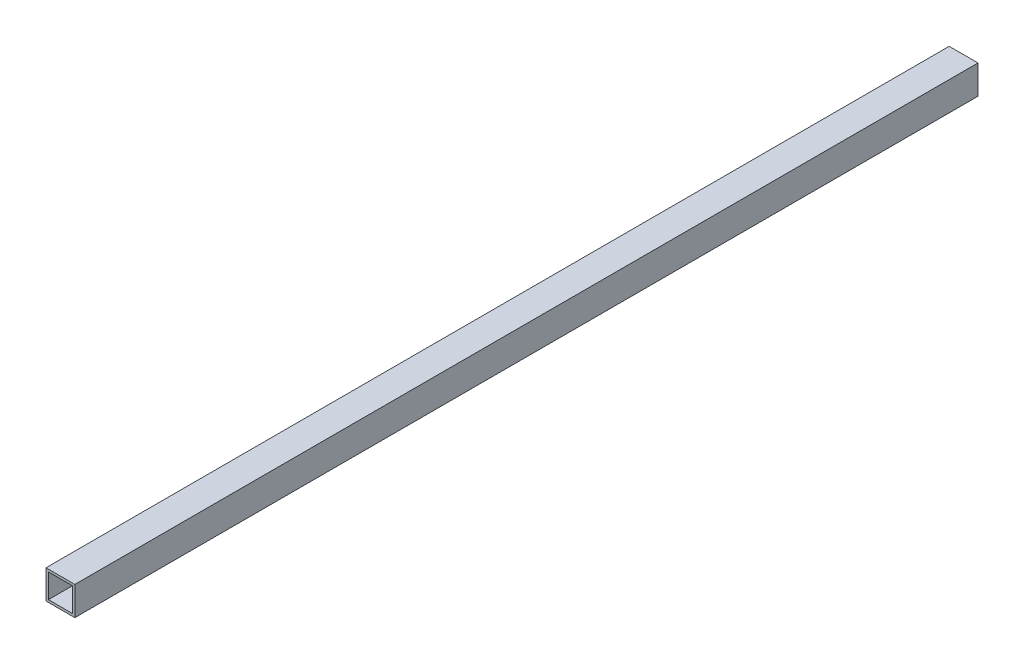
ISO-10303-21;
HEADER;
FILE_DESCRIPTION(('STEP AP214'),'2;1');
FILE_NAME('part.step','',(''),(''),'','','');
FILE_SCHEMA(('AUTOMOTIVE_DESIGN { 1 0 10303 214 1 1 1 1 }'));
ENDSEC;
DATA;
#1=APPLICATION_CONTEXT('core data for automotive mechanical design processes');
#2=APPLICATION_PROTOCOL_DEFINITION('international standard','automotive_design',2000,#1);
#3=PRODUCT_CONTEXT('',#1,'mechanical');
#4=PRODUCT('Part','Part','',(#3));
#5=PRODUCT_RELATED_PRODUCT_CATEGORY('part','',(#4));
#6=PRODUCT_DEFINITION_FORMATION('','',#4);
#7=PRODUCT_DEFINITION_CONTEXT('part definition',#1,'design');
#8=PRODUCT_DEFINITION('design','',#6,#7);
#9=PRODUCT_DEFINITION_SHAPE('','',#8);
#10=(LENGTH_UNIT() NAMED_UNIT(*) SI_UNIT(.MILLI.,.METRE.));
#11=(NAMED_UNIT(*) PLANE_ANGLE_UNIT() SI_UNIT($,.RADIAN.));
#12=(NAMED_UNIT(*) SI_UNIT($,.STERADIAN.) SOLID_ANGLE_UNIT());
#13=UNCERTAINTY_MEASURE_WITH_UNIT(LENGTH_MEASURE(1.E-05),#10,'distance_accuracy_value','');
#14=(GEOMETRIC_REPRESENTATION_CONTEXT(3) GLOBAL_UNCERTAINTY_ASSIGNED_CONTEXT((#13)) GLOBAL_UNIT_ASSIGNED_CONTEXT((#10,
#11,#12)) REPRESENTATION_CONTEXT('',''));
#15=CARTESIAN_POINT('',(0.,0.,0.));
#16=DIRECTION('',(0.,0.,1.));
#17=DIRECTION('',(1.,0.,0.));
#18=AXIS2_PLACEMENT_3D('',#15,#16,#17);
#19=CARTESIAN_POINT('',(0.,0.,596.9));
#20=DIRECTION('',(0.,0.,1.));
#21=DIRECTION('',(1.,0.,0.));
#22=AXIS2_PLACEMENT_3D('',#19,#20,#21);
#23=PLANE('',#22);
#24=DIRECTION('',(0.,-1.,0.));
#25=VECTOR('',#24,1.);
#26=CARTESIAN_POINT('',(-19.05,-19.05,596.9));
#27=LINE('',#26,#25);
#28=CARTESIAN_POINT('',(-19.05,19.0500000000001,596.9));
#29=VERTEX_POINT('',#28);
#30=CARTESIAN_POINT('',(-19.05,-19.05,596.9));
#31=VERTEX_POINT('',#30);
#32=EDGE_CURVE('E117',#29,#31,#27,.T.);
#33=ORIENTED_EDGE('',*,*,#32,.T.);
#34=DIRECTION('',(1.,0.,0.));
#35=VECTOR('',#34,1.);
#36=CARTESIAN_POINT('',(19.05,-19.05,596.9));
#37=LINE('',#36,#35);
#38=CARTESIAN_POINT('',(19.05,-19.05,596.9));
#39=VERTEX_POINT('',#38);
#40=EDGE_CURVE('E176',#31,#39,#37,.T.);
#41=ORIENTED_EDGE('',*,*,#40,.T.);
#42=DIRECTION('',(0.,1.,0.));
#43=VECTOR('',#42,1.);
#44=CARTESIAN_POINT('',(19.05,-19.05,596.9));
#45=LINE('',#44,#43);
#46=CARTESIAN_POINT('',(19.05,19.05,596.9));
#47=VERTEX_POINT('',#46);
#48=EDGE_CURVE('E179',#39,#47,#45,.T.);
#49=ORIENTED_EDGE('',*,*,#48,.T.);
#50=DIRECTION('',(-1.,0.,0.));
#51=VECTOR('',#50,1.);
#52=CARTESIAN_POINT('',(19.05,19.05,596.9));
#53=LINE('',#52,#51);
#54=EDGE_CURVE('E63',#47,#29,#53,.T.);
#55=ORIENTED_EDGE('',*,*,#54,.T.);
#56=EDGE_LOOP('',(#33,#41,#49,#55));
#57=FACE_BOUND('',#56,.T.);
#58=DIRECTION('',(1.,0.,0.));
#59=VECTOR('',#58,1.);
#60=CARTESIAN_POINT('',(15.875,-15.875,596.9));
#61=LINE('',#60,#59);
#62=CARTESIAN_POINT('',(-15.8750000000001,-15.875,596.9));
#63=VERTEX_POINT('',#62);
#64=CARTESIAN_POINT('',(15.875,-15.875,596.9));
#65=VERTEX_POINT('',#64);
#66=EDGE_CURVE('E158',#63,#65,#61,.T.);
#67=ORIENTED_EDGE('',*,*,#66,.F.);
#68=DIRECTION('',(0.,-1.,0.));
#69=VECTOR('',#68,1.);
#70=CARTESIAN_POINT('',(-15.8750000000001,-15.875,596.9));
#71=LINE('',#70,#69);
#72=CARTESIAN_POINT('',(-15.8750000000001,15.875,596.9));
#73=VERTEX_POINT('',#72);
#74=EDGE_CURVE('E113',#73,#63,#71,.T.);
#75=ORIENTED_EDGE('',*,*,#74,.F.);
#76=DIRECTION('',(-1.,0.,0.));
#77=VECTOR('',#76,1.);
#78=CARTESIAN_POINT('',(15.875,15.875,596.9));
#79=LINE('',#78,#77);
#80=CARTESIAN_POINT('',(15.875,15.875,596.9));
#81=VERTEX_POINT('',#80);
#82=EDGE_CURVE('E164',#81,#73,#79,.T.);
#83=ORIENTED_EDGE('',*,*,#82,.F.);
#84=DIRECTION('',(0.,1.,0.));
#85=VECTOR('',#84,1.);
#86=CARTESIAN_POINT('',(15.875,-15.875,596.9));
#87=LINE('',#86,#85);
#88=EDGE_CURVE('E161',#65,#81,#87,.T.);
#89=ORIENTED_EDGE('',*,*,#88,.F.);
#90=EDGE_LOOP('',(#67,#75,#83,#89));
#91=FACE_BOUND('',#90,.T.);
#92=ADVANCED_FACE('F39',(#57,#91),#23,.T.);
#93=CARTESIAN_POINT('',(-19.05,-19.05,596.9));
#94=DIRECTION('',(1.,0.,0.));
#95=DIRECTION('',(0.,0.,-1.));
#96=AXIS2_PLACEMENT_3D('',#93,#94,#95);
#97=PLANE('',#96);
#98=DIRECTION('',(0.,0.,-1.));
#99=VECTOR('',#98,1.);
#100=CARTESIAN_POINT('',(-19.05,19.0500000000001,596.9));
#101=LINE('',#100,#99);
#102=CARTESIAN_POINT('',(-19.05,19.0500000000001,-596.9));
#103=VERTEX_POINT('',#102);
#104=EDGE_CURVE('E184',#29,#103,#101,.T.);
#105=ORIENTED_EDGE('',*,*,#104,.T.);
#106=DIRECTION('',(0.,-1.,0.));
#107=VECTOR('',#106,1.);
#108=CARTESIAN_POINT('',(-19.05,-19.05,-596.9));
#109=LINE('',#108,#107);
#110=CARTESIAN_POINT('',(-19.05,-19.05,-596.9));
#111=VERTEX_POINT('',#110);
#112=EDGE_CURVE('E140',#103,#111,#109,.T.);
#113=ORIENTED_EDGE('',*,*,#112,.T.);
#114=DIRECTION('',(0.,0.,-1.));
#115=VECTOR('',#114,1.);
#116=CARTESIAN_POINT('',(-19.05,-19.05,596.9));
#117=LINE('',#116,#115);
#118=EDGE_CURVE('E11',#31,#111,#117,.T.);
#119=ORIENTED_EDGE('',*,*,#118,.F.);
#120=ORIENTED_EDGE('',*,*,#32,.F.);
#121=EDGE_LOOP('',(#105,#113,#119,#120));
#122=FACE_BOUND('',#121,.T.);
#123=ADVANCED_FACE('F41',(#122),#97,.F.);
#124=CARTESIAN_POINT('',(19.05,-19.05,596.9));
#125=DIRECTION('',(0.,1.,0.));
#126=DIRECTION('',(-1.,0.,0.));
#127=AXIS2_PLACEMENT_3D('',#124,#125,#126);
#128=PLANE('',#127);
#129=ORIENTED_EDGE('',*,*,#118,.T.);
#130=DIRECTION('',(1.,0.,0.));
#131=VECTOR('',#130,1.);
#132=CARTESIAN_POINT('',(19.05,-19.05,-596.9));
#133=LINE('',#132,#131);
#134=CARTESIAN_POINT('',(19.05,-19.05,-596.9));
#135=VERTEX_POINT('',#134);
#136=EDGE_CURVE('E144',#111,#135,#133,.T.);
#137=ORIENTED_EDGE('',*,*,#136,.T.);
#138=DIRECTION('',(0.,0.,-1.));
#139=VECTOR('',#138,1.);
#140=CARTESIAN_POINT('',(19.05,-19.05,596.9));
#141=LINE('',#140,#139);
#142=EDGE_CURVE('E48',#39,#135,#141,.T.);
#143=ORIENTED_EDGE('',*,*,#142,.F.);
#144=ORIENTED_EDGE('',*,*,#40,.F.);
#145=EDGE_LOOP('',(#129,#137,#143,#144));
#146=FACE_BOUND('',#145,.T.);
#147=ADVANCED_FACE('F200',(#146),#128,.F.);
#148=CARTESIAN_POINT('',(19.05,-19.05,596.9));
#149=DIRECTION('',(-1.,0.,0.));
#150=DIRECTION('',(0.,-1.,0.));
#151=AXIS2_PLACEMENT_3D('',#148,#149,#150);
#152=PLANE('',#151);
#153=ORIENTED_EDGE('',*,*,#142,.T.);
#154=DIRECTION('',(0.,1.,0.));
#155=VECTOR('',#154,1.);
#156=CARTESIAN_POINT('',(19.05,-19.05,-596.9));
#157=LINE('',#156,#155);
#158=CARTESIAN_POINT('',(19.05,19.05,-596.9));
#159=VERTEX_POINT('',#158);
#160=EDGE_CURVE('E148',#135,#159,#157,.T.);
#161=ORIENTED_EDGE('',*,*,#160,.T.);
#162=DIRECTION('',(0.,0.,-1.));
#163=VECTOR('',#162,1.);
#164=CARTESIAN_POINT('',(19.05,19.05,596.9));
#165=LINE('',#164,#163);
#166=EDGE_CURVE('E187',#47,#159,#165,.T.);
#167=ORIENTED_EDGE('',*,*,#166,.F.);
#168=ORIENTED_EDGE('',*,*,#48,.F.);
#169=EDGE_LOOP('',(#153,#161,#167,#168));
#170=FACE_BOUND('',#169,.T.);
#171=ADVANCED_FACE('F194',(#170),#152,.F.);
#172=CARTESIAN_POINT('',(19.05,19.05,596.9));
#173=DIRECTION('',(0.,-1.,0.));
#174=DIRECTION('',(1.,0.,0.));
#175=AXIS2_PLACEMENT_3D('',#172,#173,#174);
#176=PLANE('',#175);
#177=ORIENTED_EDGE('',*,*,#166,.T.);
#178=DIRECTION('',(-1.,0.,0.));
#179=VECTOR('',#178,1.);
#180=CARTESIAN_POINT('',(19.05,19.05,-596.9));
#181=LINE('',#180,#179);
#182=EDGE_CURVE('E152',#159,#103,#181,.T.);
#183=ORIENTED_EDGE('',*,*,#182,.T.);
#184=ORIENTED_EDGE('',*,*,#104,.F.);
#185=ORIENTED_EDGE('',*,*,#54,.F.);
#186=EDGE_LOOP('',(#177,#183,#184,#185));
#187=FACE_BOUND('',#186,.T.);
#188=ADVANCED_FACE('F205',(#187),#176,.F.);
#189=CARTESIAN_POINT('',(-15.8750000000001,-15.875,596.9));
#190=DIRECTION('',(1.,0.,0.));
#191=DIRECTION('',(0.,1.,0.));
#192=AXIS2_PLACEMENT_3D('',#189,#190,#191);
#193=PLANE('',#192);
#194=DIRECTION('',(0.,0.,-1.));
#195=VECTOR('',#194,1.);
#196=CARTESIAN_POINT('',(-15.8750000000001,-15.875,596.9));
#197=LINE('',#196,#195);
#198=CARTESIAN_POINT('',(-15.8750000000001,-15.875,-596.9));
#199=VERTEX_POINT('',#198);
#200=EDGE_CURVE('E105',#63,#199,#197,.T.);
#201=ORIENTED_EDGE('',*,*,#200,.T.);
#202=DIRECTION('',(0.,-1.,0.));
#203=VECTOR('',#202,1.);
#204=CARTESIAN_POINT('',(-15.8750000000001,-15.875,-596.9));
#205=LINE('',#204,#203);
#206=CARTESIAN_POINT('',(-15.8750000000001,15.875,-596.9));
#207=VERTEX_POINT('',#206);
#208=EDGE_CURVE('E110',#207,#199,#205,.T.);
#209=ORIENTED_EDGE('',*,*,#208,.F.);
#210=DIRECTION('',(0.,0.,-1.));
#211=VECTOR('',#210,1.);
#212=CARTESIAN_POINT('',(-15.8750000000001,15.875,596.9));
#213=LINE('',#212,#211);
#214=EDGE_CURVE('E167',#73,#207,#213,.T.);
#215=ORIENTED_EDGE('',*,*,#214,.F.);
#216=ORIENTED_EDGE('',*,*,#74,.T.);
#217=EDGE_LOOP('',(#201,#209,#215,#216));
#218=FACE_BOUND('',#217,.T.);
#219=ADVANCED_FACE('F107',(#218),#193,.T.);
#220=CARTESIAN_POINT('',(15.875,-15.875,596.9));
#221=DIRECTION('',(0.,1.,0.));
#222=DIRECTION('',(0.,0.,1.));
#223=AXIS2_PLACEMENT_3D('',#220,#221,#222);
#224=PLANE('',#223);
#225=DIRECTION('',(0.,0.,-1.));
#226=VECTOR('',#225,1.);
#227=CARTESIAN_POINT('',(15.875,-15.875,596.9));
#228=LINE('',#227,#226);
#229=CARTESIAN_POINT('',(15.875,-15.875,-596.9));
#230=VERTEX_POINT('',#229);
#231=EDGE_CURVE('E118',#65,#230,#228,.T.);
#232=ORIENTED_EDGE('',*,*,#231,.T.);
#233=DIRECTION('',(1.,0.,0.));
#234=VECTOR('',#233,1.);
#235=CARTESIAN_POINT('',(15.875,-15.875,-596.9));
#236=LINE('',#235,#234);
#237=EDGE_CURVE('E121',#199,#230,#236,.T.);
#238=ORIENTED_EDGE('',*,*,#237,.F.);
#239=ORIENTED_EDGE('',*,*,#200,.F.);
#240=ORIENTED_EDGE('',*,*,#66,.T.);
#241=EDGE_LOOP('',(#232,#238,#239,#240));
#242=FACE_BOUND('',#241,.T.);
#243=ADVANCED_FACE('F122',(#242),#224,.T.);
#244=CARTESIAN_POINT('',(15.875,-15.875,596.9));
#245=DIRECTION('',(-1.,0.,0.));
#246=DIRECTION('',(0.,0.,1.));
#247=AXIS2_PLACEMENT_3D('',#244,#245,#246);
#248=PLANE('',#247);
#249=DIRECTION('',(0.,0.,-1.));
#250=VECTOR('',#249,1.);
#251=CARTESIAN_POINT('',(15.875,15.875,596.9));
#252=LINE('',#251,#250);
#253=CARTESIAN_POINT('',(15.875,15.875,-596.9));
#254=VERTEX_POINT('',#253);
#255=EDGE_CURVE('E55',#81,#254,#252,.T.);
#256=ORIENTED_EDGE('',*,*,#255,.T.);
#257=DIRECTION('',(0.,1.,0.));
#258=VECTOR('',#257,1.);
#259=CARTESIAN_POINT('',(15.875,-15.875,-596.9));
#260=LINE('',#259,#258);
#261=EDGE_CURVE('E128',#230,#254,#260,.T.);
#262=ORIENTED_EDGE('',*,*,#261,.F.);
#263=ORIENTED_EDGE('',*,*,#231,.F.);
#264=ORIENTED_EDGE('',*,*,#88,.T.);
#265=EDGE_LOOP('',(#256,#262,#263,#264));
#266=FACE_BOUND('',#265,.T.);
#267=ADVANCED_FACE('F223',(#266),#248,.T.);
#268=CARTESIAN_POINT('',(15.875,15.875,596.9));
#269=DIRECTION('',(0.,-1.,0.));
#270=DIRECTION('',(0.,0.,-1.));
#271=AXIS2_PLACEMENT_3D('',#268,#269,#270);
#272=PLANE('',#271);
#273=ORIENTED_EDGE('',*,*,#214,.T.);
#274=DIRECTION('',(-1.,0.,0.));
#275=VECTOR('',#274,1.);
#276=CARTESIAN_POINT('',(15.875,15.875,-596.9));
#277=LINE('',#276,#275);
#278=EDGE_CURVE('E132',#254,#207,#277,.T.);
#279=ORIENTED_EDGE('',*,*,#278,.F.);
#280=ORIENTED_EDGE('',*,*,#255,.F.);
#281=ORIENTED_EDGE('',*,*,#82,.T.);
#282=EDGE_LOOP('',(#273,#279,#280,#281));
#283=FACE_BOUND('',#282,.T.);
#284=ADVANCED_FACE('F226',(#283),#272,.T.);
#285=CARTESIAN_POINT('',(0.,0.,-596.9));
#286=DIRECTION('',(0.,0.,1.));
#287=DIRECTION('',(1.,0.,0.));
#288=AXIS2_PLACEMENT_3D('',#285,#286,#287);
#289=PLANE('',#288);
#290=ORIENTED_EDGE('',*,*,#278,.T.);
#291=ORIENTED_EDGE('',*,*,#208,.T.);
#292=ORIENTED_EDGE('',*,*,#237,.T.);
#293=ORIENTED_EDGE('',*,*,#261,.T.);
#294=EDGE_LOOP('',(#290,#291,#292,#293));
#295=FACE_BOUND('',#294,.T.);
#296=ORIENTED_EDGE('',*,*,#112,.F.);
#297=ORIENTED_EDGE('',*,*,#182,.F.);
#298=ORIENTED_EDGE('',*,*,#160,.F.);
#299=ORIENTED_EDGE('',*,*,#136,.F.);
#300=EDGE_LOOP('',(#296,#297,#298,#299));
#301=FACE_BOUND('',#300,.T.);
#302=ADVANCED_FACE('F130',(#295,#301),#289,.F.);
#303=CLOSED_SHELL('',(#92,#123,#147,#171,#188,#219,#243,#267,#284,#302));
#304=MANIFOLD_SOLID_BREP('B2',#303);
#305=ADVANCED_BREP_SHAPE_REPRESENTATION('',(#18,#304),#14);
#306=SHAPE_DEFINITION_REPRESENTATION(#9,#305);
ENDSEC;
END-ISO-10303-21;
